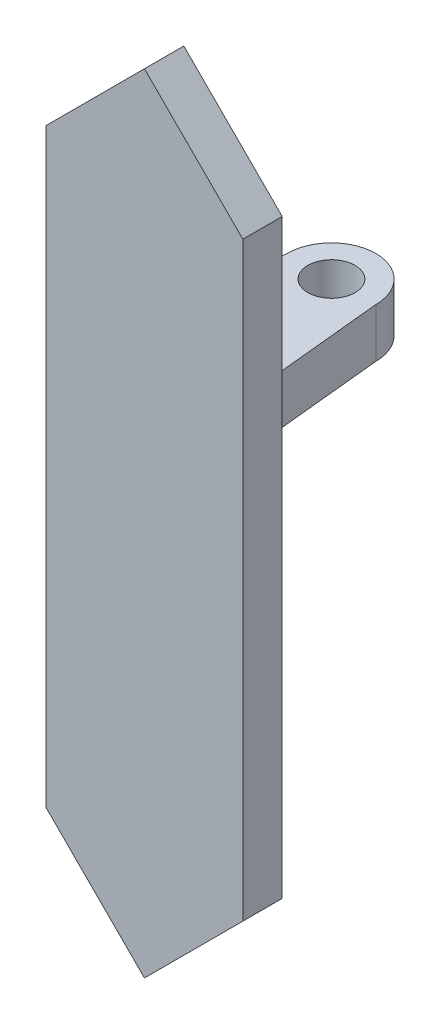
ISO-10303-21;
HEADER;
FILE_DESCRIPTION(('STEP AP214'),'2;1');
FILE_NAME('part.step','',(''),(''),'','','');
FILE_SCHEMA(('AUTOMOTIVE_DESIGN { 1 0 10303 214 1 1 1 1 }'));
ENDSEC;
DATA;
#1=APPLICATION_CONTEXT('core data for automotive mechanical design processes');
#2=APPLICATION_PROTOCOL_DEFINITION('international standard','automotive_design',2000,#1);
#3=PRODUCT_CONTEXT('',#1,'mechanical');
#4=PRODUCT('Part','Part','',(#3));
#5=PRODUCT_RELATED_PRODUCT_CATEGORY('part','',(#4));
#6=PRODUCT_DEFINITION_FORMATION('','',#4);
#7=PRODUCT_DEFINITION_CONTEXT('part definition',#1,'design');
#8=PRODUCT_DEFINITION('design','',#6,#7);
#9=PRODUCT_DEFINITION_SHAPE('','',#8);
#10=(LENGTH_UNIT() NAMED_UNIT(*) SI_UNIT(.MILLI.,.METRE.));
#11=(NAMED_UNIT(*) PLANE_ANGLE_UNIT() SI_UNIT($,.RADIAN.));
#12=(NAMED_UNIT(*) SI_UNIT($,.STERADIAN.) SOLID_ANGLE_UNIT());
#13=UNCERTAINTY_MEASURE_WITH_UNIT(LENGTH_MEASURE(1.E-05),#10,'distance_accuracy_value','');
#14=(GEOMETRIC_REPRESENTATION_CONTEXT(3) GLOBAL_UNCERTAINTY_ASSIGNED_CONTEXT((#13)) GLOBAL_UNIT_ASSIGNED_CONTEXT((#10,
#11,#12)) REPRESENTATION_CONTEXT('',''));
#15=CARTESIAN_POINT('',(0.,0.,0.));
#16=DIRECTION('',(0.,0.,1.));
#17=DIRECTION('',(1.,0.,0.));
#18=AXIS2_PLACEMENT_3D('',#15,#16,#17);
#19=CARTESIAN_POINT('',(0.,52.,-20.));
#20=DIRECTION('',(0.,1.,0.));
#21=DIRECTION('',(0.,0.,1.));
#22=AXIS2_PLACEMENT_3D('',#19,#20,#21);
#23=PLANE('',#22);
#24=CARTESIAN_POINT('',(10.1472812853162,52.,-15.));
#25=DIRECTION('',(0.,1.,0.));
#26=DIRECTION('',(0.,0.,1.));
#27=AXIS2_PLACEMENT_3D('',#24,#25,#26);
#28=CIRCLE('',#27,2.4);
#29=CARTESIAN_POINT('',(10.1472812853162,52.,-12.6));
#30=VERTEX_POINT('',#29);
#31=EDGE_CURVE('E241',#30,#30,#28,.T.);
#32=ORIENTED_EDGE('',*,*,#31,.F.);
#33=EDGE_LOOP('',(#32));
#34=FACE_BOUND('',#33,.T.);
#35=DIRECTION('',(-1.,0.,0.));
#36=VECTOR('',#35,1.);
#37=CARTESIAN_POINT('',(0.,52.,0.));
#38=LINE('',#37,#36);
#39=CARTESIAN_POINT('',(16.1472812853162,52.,0.));
#40=VERTEX_POINT('',#39);
#41=CARTESIAN_POINT('',(4.14728128531616,52.,0.));
#42=VERTEX_POINT('',#41);
#43=EDGE_CURVE('E226',#40,#42,#38,.T.);
#44=ORIENTED_EDGE('',*,*,#43,.F.);
#45=DIRECTION('',(-0.0995037190209997,0.,-0.995037190209989));
#46=VECTOR('',#45,1.);
#47=CARTESIAN_POINT('',(14.0072091933823,52.,-21.4007209193382));
#48=LINE('',#47,#46);
#49=CARTESIAN_POINT('',(14.6472812853162,52.,-15.));
#50=VERTEX_POINT('',#49);
#51=EDGE_CURVE('E235',#40,#50,#48,.T.);
#52=ORIENTED_EDGE('',*,*,#51,.T.);
#53=CARTESIAN_POINT('',(10.1472812853162,52.,-15.));
#54=DIRECTION('',(0.,1.,0.));
#55=DIRECTION('',(0.,0.,1.));
#56=AXIS2_PLACEMENT_3D('',#53,#54,#55);
#57=CIRCLE('',#56,4.5);
#58=CARTESIAN_POINT('',(5.64728128531617,52.,-15.));
#59=VERTEX_POINT('',#58);
#60=EDGE_CURVE('E232',#50,#59,#57,.T.);
#61=ORIENTED_EDGE('',*,*,#60,.T.);
#62=DIRECTION('',(0.0995037190209997,0.,-0.995037190209989));
#63=VECTOR('',#62,1.);
#64=CARTESIAN_POINT('',(6.08641711417443,52.,-19.3913582885826));
#65=LINE('',#64,#63);
#66=EDGE_CURVE('E238',#42,#59,#65,.T.);
#67=ORIENTED_EDGE('',*,*,#66,.F.);
#68=EDGE_LOOP('',(#44,#52,#61,#67));
#69=FACE_BOUND('',#68,.T.);
#70=ADVANCED_FACE('F96',(#34,#69),#23,.T.);
#71=CARTESIAN_POINT('',(0.,47.,-20.));
#72=DIRECTION('',(0.,1.,0.));
#73=DIRECTION('',(0.,0.,1.));
#74=AXIS2_PLACEMENT_3D('',#71,#72,#73);
#75=PLANE('',#74);
#76=CARTESIAN_POINT('',(10.1472812853162,47.,-15.));
#77=DIRECTION('',(0.,-1.,0.));
#78=DIRECTION('',(0.,0.,-1.));
#79=AXIS2_PLACEMENT_3D('',#76,#77,#78);
#80=CIRCLE('',#79,2.4);
#81=CARTESIAN_POINT('',(10.1472812853162,47.,-17.4));
#82=VERTEX_POINT('',#81);
#83=EDGE_CURVE('E244',#82,#82,#80,.T.);
#84=ORIENTED_EDGE('',*,*,#83,.F.);
#85=EDGE_LOOP('',(#84));
#86=FACE_BOUND('',#85,.T.);
#87=DIRECTION('',(0.0995037190209997,0.,0.995037190209989));
#88=VECTOR('',#87,1.);
#89=CARTESIAN_POINT('',(15.9874072131843,47.,-1.59874072131845));
#90=LINE('',#89,#88);
#91=CARTESIAN_POINT('',(14.6472812853162,47.,-15.));
#92=VERTEX_POINT('',#91);
#93=CARTESIAN_POINT('',(16.1472812853162,47.,0.));
#94=VERTEX_POINT('',#93);
#95=EDGE_CURVE('E250',#92,#94,#90,.T.);
#96=ORIENTED_EDGE('',*,*,#95,.T.);
#97=DIRECTION('',(-1.,0.,0.));
#98=VECTOR('',#97,1.);
#99=CARTESIAN_POINT('',(0.,47.,0.));
#100=LINE('',#99,#98);
#101=CARTESIAN_POINT('',(4.14728128531616,47.,0.));
#102=VERTEX_POINT('',#101);
#103=EDGE_CURVE('E194',#94,#102,#100,.T.);
#104=ORIENTED_EDGE('',*,*,#103,.T.);
#105=DIRECTION('',(-0.0995037190209997,0.,0.995037190209989));
#106=VECTOR('',#105,1.);
#107=CARTESIAN_POINT('',(4.10621909437243,47.,0.410621909437246));
#108=LINE('',#107,#106);
#109=CARTESIAN_POINT('',(5.64728128531617,47.,-15.));
#110=VERTEX_POINT('',#109);
#111=EDGE_CURVE('E254',#110,#102,#108,.T.);
#112=ORIENTED_EDGE('',*,*,#111,.F.);
#113=CARTESIAN_POINT('',(10.1472812853162,47.,-15.));
#114=DIRECTION('',(0.,-1.,0.));
#115=DIRECTION('',(0.,0.,-1.));
#116=AXIS2_PLACEMENT_3D('',#113,#114,#115);
#117=CIRCLE('',#116,4.5);
#118=EDGE_CURVE('E111',#110,#92,#117,.T.);
#119=ORIENTED_EDGE('',*,*,#118,.T.);
#120=EDGE_LOOP('',(#96,#104,#112,#119));
#121=FACE_BOUND('',#120,.T.);
#122=ADVANCED_FACE('F260',(#86,#121),#75,.F.);
#123=CARTESIAN_POINT('',(45.0736406426581,45.0736406426581,4.));
#124=DIRECTION('',(0.707106781186548,0.707106781186547,0.));
#125=DIRECTION('',(-0.707106781186547,0.707106781186548,0.));
#126=AXIS2_PLACEMENT_3D('',#123,#124,#125);
#127=PLANE('',#126);
#128=DIRECTION('',(0.707106781186547,-0.707106781186548,0.));
#129=VECTOR('',#128,1.);
#130=CARTESIAN_POINT('',(45.0736406426581,45.0736406426581,0.));
#131=LINE('',#130,#129);
#132=CARTESIAN_POINT('',(10.1472812853162,80.,0.));
#133=VERTEX_POINT('',#132);
#134=CARTESIAN_POINT('',(20.1472812853162,70.,0.));
#135=VERTEX_POINT('',#134);
#136=EDGE_CURVE('E199',#133,#135,#131,.T.);
#137=ORIENTED_EDGE('',*,*,#136,.F.);
#138=DIRECTION('',(0.,0.,-1.));
#139=VECTOR('',#138,1.);
#140=CARTESIAN_POINT('',(10.1472812853162,80.,4.));
#141=LINE('',#140,#139);
#142=CARTESIAN_POINT('',(10.1472812853162,80.,4.));
#143=VERTEX_POINT('',#142);
#144=EDGE_CURVE('E183',#143,#133,#141,.T.);
#145=ORIENTED_EDGE('',*,*,#144,.F.);
#146=DIRECTION('',(0.707106781186547,-0.707106781186548,0.));
#147=VECTOR('',#146,1.);
#148=CARTESIAN_POINT('',(45.0736406426581,45.0736406426581,4.));
#149=LINE('',#148,#147);
#150=CARTESIAN_POINT('',(20.1472812853162,70.,4.));
#151=VERTEX_POINT('',#150);
#152=EDGE_CURVE('E167',#143,#151,#149,.T.);
#153=ORIENTED_EDGE('',*,*,#152,.T.);
#154=DIRECTION('',(0.,0.,-1.));
#155=VECTOR('',#154,1.);
#156=CARTESIAN_POINT('',(20.1472812853162,70.,4.));
#157=LINE('',#156,#155);
#158=EDGE_CURVE('E175',#151,#135,#157,.T.);
#159=ORIENTED_EDGE('',*,*,#158,.T.);
#160=EDGE_LOOP('',(#137,#145,#153,#159));
#161=FACE_BOUND('',#160,.T.);
#162=ADVANCED_FACE('F185',(#161),#127,.T.);
#163=CARTESIAN_POINT('',(0.,0.,0.));
#164=DIRECTION('',(0.,0.,1.));
#165=DIRECTION('',(1.,0.,0.));
#166=AXIS2_PLACEMENT_3D('',#163,#164,#165);
#167=PLANE('',#166);
#168=ORIENTED_EDGE('',*,*,#43,.T.);
#169=DIRECTION('',(0.,-1.,0.));
#170=VECTOR('',#169,1.);
#171=CARTESIAN_POINT('',(4.14728128531616,0.,0.));
#172=LINE('',#171,#170);
#173=EDGE_CURVE('E229',#42,#102,#172,.T.);
#174=ORIENTED_EDGE('',*,*,#173,.T.);
#175=ORIENTED_EDGE('',*,*,#103,.F.);
#176=DIRECTION('',(0.,-1.,0.));
#177=VECTOR('',#176,1.);
#178=CARTESIAN_POINT('',(16.1472812853162,0.,0.));
#179=LINE('',#178,#177);
#180=EDGE_CURVE('E223',#40,#94,#179,.T.);
#181=ORIENTED_EDGE('',*,*,#180,.F.);
#182=EDGE_LOOP('',(#168,#174,#175,#181));
#183=FACE_BOUND('',#182,.T.);
#184=DIRECTION('',(0.,1.,0.));
#185=VECTOR('',#184,1.);
#186=CARTESIAN_POINT('',(0.147281285316174,0.,0.));
#187=LINE('',#186,#185);
#188=CARTESIAN_POINT('',(0.147281285316174,9.99999999999999,0.));
#189=VERTEX_POINT('',#188);
#190=CARTESIAN_POINT('',(0.147281285316174,70.,0.));
#191=VERTEX_POINT('',#190);
#192=EDGE_CURVE('E191',#189,#191,#187,.T.);
#193=ORIENTED_EDGE('',*,*,#192,.T.);
#194=DIRECTION('',(0.707106781186548,0.707106781186548,0.));
#195=VECTOR('',#194,1.);
#196=CARTESIAN_POINT('',(-34.9263593573419,34.9263593573419,0.));
#197=LINE('',#196,#195);
#198=EDGE_CURVE('E201',#191,#133,#197,.T.);
#199=ORIENTED_EDGE('',*,*,#198,.T.);
#200=ORIENTED_EDGE('',*,*,#136,.T.);
#201=DIRECTION('',(0.,1.,0.));
#202=VECTOR('',#201,1.);
#203=CARTESIAN_POINT('',(20.1472812853162,0.,0.));
#204=LINE('',#203,#202);
#205=CARTESIAN_POINT('',(20.1472812853162,10.,0.));
#206=VERTEX_POINT('',#205);
#207=EDGE_CURVE('E178',#206,#135,#204,.T.);
#208=ORIENTED_EDGE('',*,*,#207,.F.);
#209=DIRECTION('',(0.707106781186548,0.707106781186548,0.));
#210=VECTOR('',#209,1.);
#211=CARTESIAN_POINT('',(5.07364064265808,-5.07364064265808,0.));
#212=LINE('',#211,#210);
#213=CARTESIAN_POINT('',(10.1472812853162,0.,0.));
#214=VERTEX_POINT('',#213);
#215=EDGE_CURVE('E196',#214,#206,#212,.T.);
#216=ORIENTED_EDGE('',*,*,#215,.F.);
#217=DIRECTION('',(0.707106781186548,-0.707106781186548,0.));
#218=VECTOR('',#217,1.);
#219=CARTESIAN_POINT('',(5.07364064265808,5.07364064265808,0.));
#220=LINE('',#219,#218);
#221=EDGE_CURVE('E193',#189,#214,#220,.T.);
#222=ORIENTED_EDGE('',*,*,#221,.F.);
#223=EDGE_LOOP('',(#193,#199,#200,#208,#216,#222));
#224=FACE_BOUND('',#223,.T.);
#225=ADVANCED_FACE('F215',(#183,#224),#167,.F.);
#226=CARTESIAN_POINT('',(20.1472812853162,0.,4.));
#227=DIRECTION('',(-1.,0.,0.));
#228=DIRECTION('',(0.,0.,1.));
#229=AXIS2_PLACEMENT_3D('',#226,#227,#228);
#230=PLANE('',#229);
#231=ORIENTED_EDGE('',*,*,#207,.T.);
#232=ORIENTED_EDGE('',*,*,#158,.F.);
#233=DIRECTION('',(0.,1.,0.));
#234=VECTOR('',#233,1.);
#235=CARTESIAN_POINT('',(20.1472812853162,0.,4.));
#236=LINE('',#235,#234);
#237=CARTESIAN_POINT('',(20.1472812853162,10.,4.));
#238=VERTEX_POINT('',#237);
#239=EDGE_CURVE('E161',#238,#151,#236,.T.);
#240=ORIENTED_EDGE('',*,*,#239,.F.);
#241=DIRECTION('',(0.,0.,-1.));
#242=VECTOR('',#241,1.);
#243=CARTESIAN_POINT('',(20.1472812853162,10.,4.));
#244=LINE('',#243,#242);
#245=EDGE_CURVE('E182',#238,#206,#244,.T.);
#246=ORIENTED_EDGE('',*,*,#245,.T.);
#247=EDGE_LOOP('',(#231,#232,#240,#246));
#248=FACE_BOUND('',#247,.T.);
#249=ADVANCED_FACE('F176',(#248),#230,.F.);
#250=CARTESIAN_POINT('',(5.07364064265808,-5.07364064265808,4.));
#251=DIRECTION('',(-0.707106781186547,0.707106781186547,0.));
#252=DIRECTION('',(-0.707106781186548,-0.707106781186548,0.));
#253=AXIS2_PLACEMENT_3D('',#250,#251,#252);
#254=PLANE('',#253);
#255=ORIENTED_EDGE('',*,*,#215,.T.);
#256=ORIENTED_EDGE('',*,*,#245,.F.);
#257=DIRECTION('',(0.707106781186548,0.707106781186548,0.));
#258=VECTOR('',#257,1.);
#259=CARTESIAN_POINT('',(5.07364064265808,-5.07364064265808,4.));
#260=LINE('',#259,#258);
#261=CARTESIAN_POINT('',(10.1472812853162,0.,4.));
#262=VERTEX_POINT('',#261);
#263=EDGE_CURVE('E169',#262,#238,#260,.T.);
#264=ORIENTED_EDGE('',*,*,#263,.F.);
#265=DIRECTION('',(0.,0.,-1.));
#266=VECTOR('',#265,1.);
#267=CARTESIAN_POINT('',(10.1472812853162,0.,4.));
#268=LINE('',#267,#266);
#269=EDGE_CURVE('E104',#262,#214,#268,.T.);
#270=ORIENTED_EDGE('',*,*,#269,.T.);
#271=EDGE_LOOP('',(#255,#256,#264,#270));
#272=FACE_BOUND('',#271,.T.);
#273=ADVANCED_FACE('F211',(#272),#254,.F.);
#274=CARTESIAN_POINT('',(5.07364064265808,5.07364064265808,4.));
#275=DIRECTION('',(0.707106781186547,0.707106781186547,0.));
#276=DIRECTION('',(-0.707106781186548,0.707106781186548,0.));
#277=AXIS2_PLACEMENT_3D('',#274,#275,#276);
#278=PLANE('',#277);
#279=ORIENTED_EDGE('',*,*,#221,.T.);
#280=ORIENTED_EDGE('',*,*,#269,.F.);
#281=DIRECTION('',(0.707106781186548,-0.707106781186548,0.));
#282=VECTOR('',#281,1.);
#283=CARTESIAN_POINT('',(5.07364064265808,5.07364064265808,4.));
#284=LINE('',#283,#282);
#285=CARTESIAN_POINT('',(0.147281285316174,9.99999999999999,4.));
#286=VERTEX_POINT('',#285);
#287=EDGE_CURVE('E217',#286,#262,#284,.T.);
#288=ORIENTED_EDGE('',*,*,#287,.F.);
#289=DIRECTION('',(0.,0.,-1.));
#290=VECTOR('',#289,1.);
#291=CARTESIAN_POINT('',(0.147281285316174,9.99999999999999,4.));
#292=LINE('',#291,#290);
#293=EDGE_CURVE('E12',#286,#189,#292,.T.);
#294=ORIENTED_EDGE('',*,*,#293,.T.);
#295=EDGE_LOOP('',(#279,#280,#288,#294));
#296=FACE_BOUND('',#295,.T.);
#297=ADVANCED_FACE('F317',(#296),#278,.F.);
#298=CARTESIAN_POINT('',(0.147281285316174,0.,4.));
#299=DIRECTION('',(-1.,0.,0.));
#300=DIRECTION('',(0.,0.,1.));
#301=AXIS2_PLACEMENT_3D('',#298,#299,#300);
#302=PLANE('',#301);
#303=ORIENTED_EDGE('',*,*,#192,.F.);
#304=ORIENTED_EDGE('',*,*,#293,.F.);
#305=DIRECTION('',(0.,1.,0.));
#306=VECTOR('',#305,1.);
#307=CARTESIAN_POINT('',(0.147281285316174,0.,4.));
#308=LINE('',#307,#306);
#309=CARTESIAN_POINT('',(0.147281285316174,70.,4.));
#310=VERTEX_POINT('',#309);
#311=EDGE_CURVE('E204',#286,#310,#308,.T.);
#312=ORIENTED_EDGE('',*,*,#311,.T.);
#313=DIRECTION('',(0.,0.,-1.));
#314=VECTOR('',#313,1.);
#315=CARTESIAN_POINT('',(0.147281285316174,70.,4.));
#316=LINE('',#315,#314);
#317=EDGE_CURVE('E120',#310,#191,#316,.T.);
#318=ORIENTED_EDGE('',*,*,#317,.T.);
#319=EDGE_LOOP('',(#303,#304,#312,#318));
#320=FACE_BOUND('',#319,.T.);
#321=ADVANCED_FACE('F98',(#320),#302,.T.);
#322=CARTESIAN_POINT('',(-34.9263593573419,34.9263593573419,4.));
#323=DIRECTION('',(-0.707106781186547,0.707106781186547,0.));
#324=DIRECTION('',(-0.707106781186548,-0.707106781186548,0.));
#325=AXIS2_PLACEMENT_3D('',#322,#323,#324);
#326=PLANE('',#325);
#327=ORIENTED_EDGE('',*,*,#198,.F.);
#328=ORIENTED_EDGE('',*,*,#317,.F.);
#329=DIRECTION('',(0.707106781186548,0.707106781186548,0.));
#330=VECTOR('',#329,1.);
#331=CARTESIAN_POINT('',(-34.9263593573419,34.9263593573419,4.));
#332=LINE('',#331,#330);
#333=EDGE_CURVE('E186',#310,#143,#332,.T.);
#334=ORIENTED_EDGE('',*,*,#333,.T.);
#335=ORIENTED_EDGE('',*,*,#144,.T.);
#336=EDGE_LOOP('',(#327,#328,#334,#335));
#337=FACE_BOUND('',#336,.T.);
#338=ADVANCED_FACE('F216',(#337),#326,.T.);
#339=CARTESIAN_POINT('',(0.,0.,4.));
#340=DIRECTION('',(0.,0.,1.));
#341=DIRECTION('',(1.,0.,0.));
#342=AXIS2_PLACEMENT_3D('',#339,#340,#341);
#343=PLANE('',#342);
#344=ORIENTED_EDGE('',*,*,#311,.F.);
#345=ORIENTED_EDGE('',*,*,#287,.T.);
#346=ORIENTED_EDGE('',*,*,#263,.T.);
#347=ORIENTED_EDGE('',*,*,#239,.T.);
#348=ORIENTED_EDGE('',*,*,#152,.F.);
#349=ORIENTED_EDGE('',*,*,#333,.F.);
#350=EDGE_LOOP('',(#344,#345,#346,#347,#348,#349));
#351=FACE_BOUND('',#350,.T.);
#352=ADVANCED_FACE('F164',(#351),#343,.T.);
#353=CARTESIAN_POINT('',(10.1472812853162,68.,-15.));
#354=DIRECTION('',(0.,-1.,0.));
#355=DIRECTION('',(0.,0.,-1.));
#356=AXIS2_PLACEMENT_3D('',#353,#354,#355);
#357=CYLINDRICAL_SURFACE('',#356,2.4);
#358=ORIENTED_EDGE('',*,*,#31,.T.);
#359=EDGE_LOOP('',(#358));
#360=FACE_BOUND('',#359,.T.);
#361=ORIENTED_EDGE('',*,*,#83,.T.);
#362=EDGE_LOOP('',(#361));
#363=FACE_BOUND('',#362,.T.);
#364=ADVANCED_FACE('F307',(#360,#363),#357,.F.);
#365=CARTESIAN_POINT('',(10.1472812853162,68.,-15.));
#366=DIRECTION('',(0.,-1.,0.));
#367=DIRECTION('',(0.,0.,-1.));
#368=AXIS2_PLACEMENT_3D('',#365,#366,#367);
#369=CYLINDRICAL_SURFACE('',#368,4.5);
#370=DIRECTION('',(0.,-1.,0.));
#371=VECTOR('',#370,1.);
#372=CARTESIAN_POINT('',(14.6472812853162,68.,-15.));
#373=LINE('',#372,#371);
#374=EDGE_CURVE('E247',#50,#92,#373,.T.);
#375=ORIENTED_EDGE('',*,*,#374,.T.);
#376=ORIENTED_EDGE('',*,*,#118,.F.);
#377=DIRECTION('',(0.,-1.,0.));
#378=VECTOR('',#377,1.);
#379=CARTESIAN_POINT('',(5.64728128531617,68.,-15.));
#380=LINE('',#379,#378);
#381=EDGE_CURVE('E248',#59,#110,#380,.T.);
#382=ORIENTED_EDGE('',*,*,#381,.F.);
#383=ORIENTED_EDGE('',*,*,#60,.F.);
#384=EDGE_LOOP('',(#375,#376,#382,#383));
#385=FACE_BOUND('',#384,.T.);
#386=ADVANCED_FACE('F279',(#385),#369,.T.);
#387=CARTESIAN_POINT('',(15.9874072131843,68.,-1.59874072131845));
#388=DIRECTION('',(0.995037190209989,0.,-0.0995037190209997));
#389=DIRECTION('',(-0.0995037190209997,0.,-0.995037190209989));
#390=AXIS2_PLACEMENT_3D('',#387,#388,#389);
#391=PLANE('',#390);
#392=ORIENTED_EDGE('',*,*,#180,.T.);
#393=ORIENTED_EDGE('',*,*,#95,.F.);
#394=ORIENTED_EDGE('',*,*,#374,.F.);
#395=ORIENTED_EDGE('',*,*,#51,.F.);
#396=EDGE_LOOP('',(#392,#393,#394,#395));
#397=FACE_BOUND('',#396,.T.);
#398=ADVANCED_FACE('F282',(#397),#391,.T.);
#399=CARTESIAN_POINT('',(4.10621909437243,68.,0.410621909437246));
#400=DIRECTION('',(0.995037190209989,0.,0.0995037190209996));
#401=DIRECTION('',(0.0995037190209997,0.,-0.995037190209989));
#402=AXIS2_PLACEMENT_3D('',#399,#400,#401);
#403=PLANE('',#402);
#404=ORIENTED_EDGE('',*,*,#66,.T.);
#405=ORIENTED_EDGE('',*,*,#381,.T.);
#406=ORIENTED_EDGE('',*,*,#111,.T.);
#407=ORIENTED_EDGE('',*,*,#173,.F.);
#408=EDGE_LOOP('',(#404,#405,#406,#407));
#409=FACE_BOUND('',#408,.T.);
#410=ADVANCED_FACE('F286',(#409),#403,.F.);
#411=CLOSED_SHELL('',(#70,#122,#162,#225,#249,#273,#297,#321,#338,#352,#364,#386,#398,#410));
#412=MANIFOLD_SOLID_BREP('B2',#411);
#413=ADVANCED_BREP_SHAPE_REPRESENTATION('',(#18,#412),#14);
#414=SHAPE_DEFINITION_REPRESENTATION(#9,#413);
ENDSEC;
END-ISO-10303-21;
